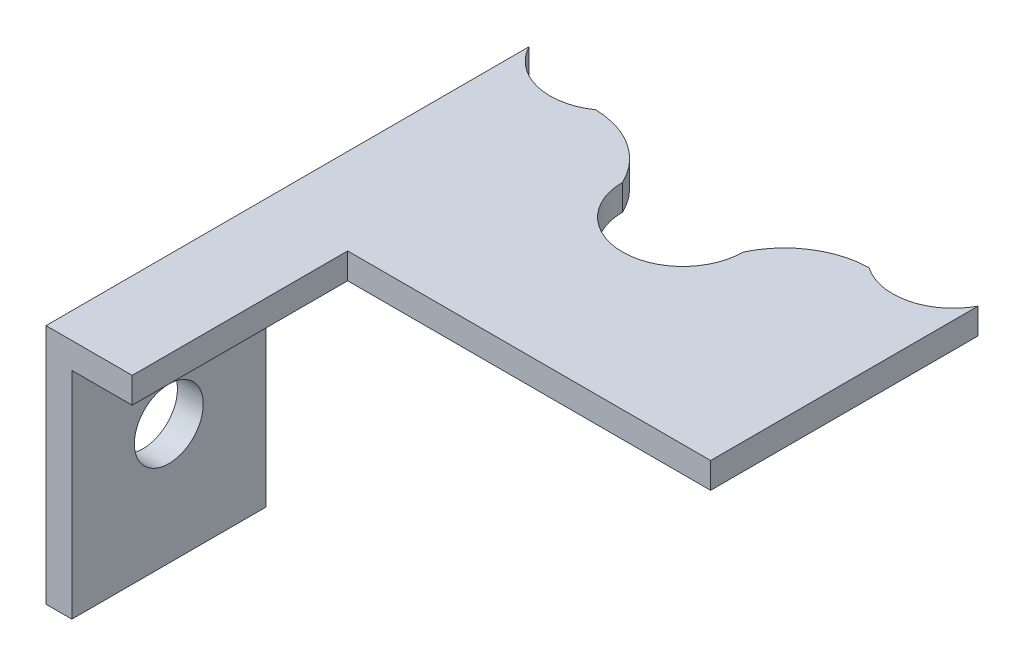
ISO-10303-21;
HEADER;
FILE_DESCRIPTION(('STEP AP214'),'2;1');
FILE_NAME('part.step','',(''),(''),'','','');
FILE_SCHEMA(('AUTOMOTIVE_DESIGN { 1 0 10303 214 1 1 1 1 }'));
ENDSEC;
DATA;
#1=APPLICATION_CONTEXT('core data for automotive mechanical design processes');
#2=APPLICATION_PROTOCOL_DEFINITION('international standard','automotive_design',2000,#1);
#3=PRODUCT_CONTEXT('',#1,'mechanical');
#4=PRODUCT('Part','Part','',(#3));
#5=PRODUCT_RELATED_PRODUCT_CATEGORY('part','',(#4));
#6=PRODUCT_DEFINITION_FORMATION('','',#4);
#7=PRODUCT_DEFINITION_CONTEXT('part definition',#1,'design');
#8=PRODUCT_DEFINITION('design','',#6,#7);
#9=PRODUCT_DEFINITION_SHAPE('','',#8);
#10=(LENGTH_UNIT() NAMED_UNIT(*) SI_UNIT(.MILLI.,.METRE.));
#11=(NAMED_UNIT(*) PLANE_ANGLE_UNIT() SI_UNIT($,.RADIAN.));
#12=(NAMED_UNIT(*) SI_UNIT($,.STERADIAN.) SOLID_ANGLE_UNIT());
#13=UNCERTAINTY_MEASURE_WITH_UNIT(LENGTH_MEASURE(1.E-05),#10,'distance_accuracy_value','');
#14=(GEOMETRIC_REPRESENTATION_CONTEXT(3) GLOBAL_UNCERTAINTY_ASSIGNED_CONTEXT((#13)) GLOBAL_UNIT_ASSIGNED_CONTEXT((#10,
#11,#12)) REPRESENTATION_CONTEXT('',''));
#15=CARTESIAN_POINT('',(0.,0.,0.));
#16=DIRECTION('',(0.,0.,1.));
#17=DIRECTION('',(1.,0.,0.));
#18=AXIS2_PLACEMENT_3D('',#15,#16,#17);
#19=CARTESIAN_POINT('',(16.0451571243017,0.,4.26440295899608));
#20=DIRECTION('',(0.,1.,0.));
#21=DIRECTION('',(0.,0.,1.));
#22=AXIS2_PLACEMENT_3D('',#19,#20,#21);
#23=PLANE('',#22);
#24=DIRECTION('',(0.,0.,1.));
#25=VECTOR('',#24,1.);
#26=CARTESIAN_POINT('',(-23.0555691185354,0.,47.8349535593541));
#27=LINE('',#26,#25);
#28=CARTESIAN_POINT('',(-23.0555691185354,0.,25.3349535593541));
#29=VERTEX_POINT('',#28);
#30=CARTESIAN_POINT('',(-23.0555691185354,0.,47.8349535593541));
#31=VERTEX_POINT('',#30);
#32=EDGE_CURVE('E153',#29,#31,#27,.T.);
#33=ORIENTED_EDGE('',*,*,#32,.F.);
#34=DIRECTION('',(1.,0.,0.));
#35=VECTOR('',#34,1.);
#36=CARTESIAN_POINT('',(-26.0555691185354,0.,25.3349535593541));
#37=LINE('',#36,#35);
#38=CARTESIAN_POINT('',(-26.0555691185354,0.,25.3349535593541));
#39=VERTEX_POINT('',#38);
#40=EDGE_CURVE('E54',#39,#29,#37,.T.);
#41=ORIENTED_EDGE('',*,*,#40,.F.);
#42=DIRECTION('',(0.,0.,1.));
#43=VECTOR('',#42,1.);
#44=CARTESIAN_POINT('',(-26.0555691185354,0.,22.8349535593541));
#45=LINE('',#44,#43);
#46=CARTESIAN_POINT('',(-26.0555691185354,0.,-8.18804644064587));
#47=VERTEX_POINT('',#46);
#48=EDGE_CURVE('E157',#47,#39,#45,.T.);
#49=ORIENTED_EDGE('',*,*,#48,.F.);
#50=CARTESIAN_POINT('',(-19.8752830168529,0.,-11.4749999999999));
#51=DIRECTION('',(0.,-1.,0.));
#52=DIRECTION('',(0.,0.,-1.));
#53=AXIS2_PLACEMENT_3D('',#50,#51,#52);
#54=CIRCLE('',#53,7.);
#55=CARTESIAN_POINT('',(-15.8700792263388,0.,-5.73406431002294));
#56=VERTEX_POINT('',#55);
#57=EDGE_CURVE('E206',#56,#47,#54,.T.);
#58=ORIENTED_EDGE('',*,*,#57,.F.);
#59=CARTESIAN_POINT('',(-16.0451571243017,0.,4.26440295899608));
#60=DIRECTION('',(0.,1.,0.));
#61=DIRECTION('',(0.,0.,1.));
#62=AXIS2_PLACEMENT_3D('',#59,#60,#61);
#63=CIRCLE('',#62,9.99999999999999);
#64=CARTESIAN_POINT('',(-7.,0.,0.));
#65=VERTEX_POINT('',#64);
#66=EDGE_CURVE('E204',#65,#56,#63,.T.);
#67=ORIENTED_EDGE('',*,*,#66,.F.);
#68=CARTESIAN_POINT('',(0.,0.,0.));
#69=DIRECTION('',(0.,-1.,0.));
#70=DIRECTION('',(0.,0.,-1.));
#71=AXIS2_PLACEMENT_3D('',#68,#69,#70);
#72=CIRCLE('',#71,7.);
#73=CARTESIAN_POINT('',(7.,0.,0.));
#74=VERTEX_POINT('',#73);
#75=EDGE_CURVE('E202',#74,#65,#72,.T.);
#76=ORIENTED_EDGE('',*,*,#75,.F.);
#77=CARTESIAN_POINT('',(16.0451571243017,0.,4.26440295899608));
#78=DIRECTION('',(0.,1.,0.));
#79=DIRECTION('',(0.,0.,1.));
#80=AXIS2_PLACEMENT_3D('',#77,#78,#79);
#81=CIRCLE('',#80,10.);
#82=CARTESIAN_POINT('',(15.8700792263388,0.,-5.73406431002295));
#83=VERTEX_POINT('',#82);
#84=EDGE_CURVE('E180',#83,#74,#81,.T.);
#85=ORIENTED_EDGE('',*,*,#84,.F.);
#86=CARTESIAN_POINT('',(19.8752830168529,0.,-11.4749999999999));
#87=DIRECTION('',(0.,-1.,0.));
#88=DIRECTION('',(0.,0.,1.));
#89=AXIS2_PLACEMENT_3D('',#86,#87,#88);
#90=CIRCLE('',#89,7.);
#91=CARTESIAN_POINT('',(26.0555691185354,0.,-8.18804644064582));
#92=VERTEX_POINT('',#91);
#93=EDGE_CURVE('E185',#92,#83,#90,.T.);
#94=ORIENTED_EDGE('',*,*,#93,.F.);
#95=DIRECTION('',(0.,0.,-1.));
#96=VECTOR('',#95,1.);
#97=CARTESIAN_POINT('',(26.0555691185354,0.,-8.18804644064582));
#98=LINE('',#97,#96);
#99=CARTESIAN_POINT('',(26.0555691185354,0.,22.8349535593541));
#100=VERTEX_POINT('',#99);
#101=EDGE_CURVE('E211',#100,#92,#98,.T.);
#102=ORIENTED_EDGE('',*,*,#101,.F.);
#103=DIRECTION('',(1.,0.,0.));
#104=VECTOR('',#103,1.);
#105=CARTESIAN_POINT('',(26.0555691185354,0.,22.8349535593541));
#106=LINE('',#105,#104);
#107=CARTESIAN_POINT('',(-16.0555691185354,0.,22.8349535593541));
#108=VERTEX_POINT('',#107);
#109=EDGE_CURVE('E209',#108,#100,#106,.T.);
#110=ORIENTED_EDGE('',*,*,#109,.F.);
#111=DIRECTION('',(0.,0.,-1.));
#112=VECTOR('',#111,1.);
#113=CARTESIAN_POINT('',(-16.0555691185354,0.,47.8349535593541));
#114=LINE('',#113,#112);
#115=CARTESIAN_POINT('',(-16.0555691185354,0.,47.8349535593541));
#116=VERTEX_POINT('',#115);
#117=EDGE_CURVE('E177',#116,#108,#114,.T.);
#118=ORIENTED_EDGE('',*,*,#117,.F.);
#119=DIRECTION('',(1.,0.,0.));
#120=VECTOR('',#119,1.);
#121=CARTESIAN_POINT('',(-26.0555691185354,0.,47.8349535593541));
#122=LINE('',#121,#120);
#123=EDGE_CURVE('E60',#31,#116,#122,.T.);
#124=ORIENTED_EDGE('',*,*,#123,.F.);
#125=EDGE_LOOP('',(#33,#41,#49,#58,#67,#76,#85,#94,#102,#110,#118,#124));
#126=FACE_BOUND('',#125,.T.);
#127=ADVANCED_FACE('F39',(#126),#23,.F.);
#128=CARTESIAN_POINT('',(26.0555691185354,3.,22.8349535593541));
#129=DIRECTION('',(0.,0.,-1.));
#130=DIRECTION('',(-1.,0.,0.));
#131=AXIS2_PLACEMENT_3D('',#128,#129,#130);
#132=PLANE('',#131);
#133=DIRECTION('',(0.,1.,0.));
#134=VECTOR('',#133,1.);
#135=CARTESIAN_POINT('',(-16.0555691185354,3.,22.8349535593541));
#136=LINE('',#135,#134);
#137=CARTESIAN_POINT('',(-16.0555691185354,3.,22.8349535593541));
#138=VERTEX_POINT('',#137);
#139=EDGE_CURVE('E158',#108,#138,#136,.T.);
#140=ORIENTED_EDGE('',*,*,#139,.F.);
#141=ORIENTED_EDGE('',*,*,#109,.T.);
#142=DIRECTION('',(0.,-1.,0.));
#143=VECTOR('',#142,1.);
#144=CARTESIAN_POINT('',(26.0555691185354,3.,22.8349535593541));
#145=LINE('',#144,#143);
#146=CARTESIAN_POINT('',(26.0555691185354,3.,22.8349535593541));
#147=VERTEX_POINT('',#146);
#148=EDGE_CURVE('E219',#147,#100,#145,.T.);
#149=ORIENTED_EDGE('',*,*,#148,.F.);
#150=DIRECTION('',(1.,0.,0.));
#151=VECTOR('',#150,1.);
#152=CARTESIAN_POINT('',(26.0555691185354,3.,22.8349535593541));
#153=LINE('',#152,#151);
#154=EDGE_CURVE('E193',#138,#147,#153,.T.);
#155=ORIENTED_EDGE('',*,*,#154,.F.);
#156=EDGE_LOOP('',(#140,#141,#149,#155));
#157=FACE_BOUND('',#156,.T.);
#158=ADVANCED_FACE('F261',(#157),#132,.F.);
#159=CARTESIAN_POINT('',(16.0451571243017,3.,4.26440295899608));
#160=DIRECTION('',(0.,-1.,0.));
#161=DIRECTION('',(0.,0.,-1.));
#162=AXIS2_PLACEMENT_3D('',#159,#160,#161);
#163=CYLINDRICAL_SURFACE('',#162,10.);
#164=ORIENTED_EDGE('',*,*,#84,.T.);
#165=DIRECTION('',(0.,-1.,0.));
#166=VECTOR('',#165,1.);
#167=CARTESIAN_POINT('',(7.,3.,0.));
#168=LINE('',#167,#166);
#169=CARTESIAN_POINT('',(7.,3.,0.));
#170=VERTEX_POINT('',#169);
#171=EDGE_CURVE('E11',#170,#74,#168,.T.);
#172=ORIENTED_EDGE('',*,*,#171,.F.);
#173=CARTESIAN_POINT('',(16.0451571243017,3.,4.26440295899608));
#174=DIRECTION('',(0.,1.,0.));
#175=DIRECTION('',(0.,0.,1.));
#176=AXIS2_PLACEMENT_3D('',#173,#174,#175);
#177=CIRCLE('',#176,10.);
#178=CARTESIAN_POINT('',(15.8700792263388,3.,-5.73406431002295));
#179=VERTEX_POINT('',#178);
#180=EDGE_CURVE('E181',#179,#170,#177,.T.);
#181=ORIENTED_EDGE('',*,*,#180,.F.);
#182=DIRECTION('',(0.,-1.,0.));
#183=VECTOR('',#182,1.);
#184=CARTESIAN_POINT('',(15.8700792263388,3.,-5.73406431002295));
#185=LINE('',#184,#183);
#186=EDGE_CURVE('E199',#179,#83,#185,.T.);
#187=ORIENTED_EDGE('',*,*,#186,.T.);
#188=EDGE_LOOP('',(#164,#172,#181,#187));
#189=FACE_BOUND('',#188,.T.);
#190=ADVANCED_FACE('F41',(#189),#163,.T.);
#191=CARTESIAN_POINT('',(0.,3.,0.));
#192=DIRECTION('',(0.,-1.,0.));
#193=DIRECTION('',(0.,0.,-1.));
#194=AXIS2_PLACEMENT_3D('',#191,#192,#193);
#195=CYLINDRICAL_SURFACE('',#194,7.);
#196=ORIENTED_EDGE('',*,*,#75,.T.);
#197=DIRECTION('',(0.,-1.,0.));
#198=VECTOR('',#197,1.);
#199=CARTESIAN_POINT('',(-7.,3.,0.));
#200=LINE('',#199,#198);
#201=CARTESIAN_POINT('',(-7.,3.,0.));
#202=VERTEX_POINT('',#201);
#203=EDGE_CURVE('E47',#202,#65,#200,.T.);
#204=ORIENTED_EDGE('',*,*,#203,.F.);
#205=CARTESIAN_POINT('',(0.,3.,0.));
#206=DIRECTION('',(0.,-1.,0.));
#207=DIRECTION('',(0.,0.,-1.));
#208=AXIS2_PLACEMENT_3D('',#205,#206,#207);
#209=CIRCLE('',#208,7.);
#210=EDGE_CURVE('E184',#170,#202,#209,.T.);
#211=ORIENTED_EDGE('',*,*,#210,.F.);
#212=ORIENTED_EDGE('',*,*,#171,.T.);
#213=EDGE_LOOP('',(#196,#204,#211,#212));
#214=FACE_BOUND('',#213,.T.);
#215=ADVANCED_FACE('F246',(#214),#195,.F.);
#216=CARTESIAN_POINT('',(-16.0451571243017,3.,4.26440295899608));
#217=DIRECTION('',(0.,-1.,0.));
#218=DIRECTION('',(0.,0.,-1.));
#219=AXIS2_PLACEMENT_3D('',#216,#217,#218);
#220=CYLINDRICAL_SURFACE('',#219,9.99999999999999);
#221=ORIENTED_EDGE('',*,*,#66,.T.);
#222=DIRECTION('',(0.,-1.,0.));
#223=VECTOR('',#222,1.);
#224=CARTESIAN_POINT('',(-15.8700792263388,3.,-5.73406431002294));
#225=LINE('',#224,#223);
#226=CARTESIAN_POINT('',(-15.8700792263388,3.,-5.73406431002294));
#227=VERTEX_POINT('',#226);
#228=EDGE_CURVE('E224',#227,#56,#225,.T.);
#229=ORIENTED_EDGE('',*,*,#228,.F.);
#230=CARTESIAN_POINT('',(-16.0451571243017,3.,4.26440295899608));
#231=DIRECTION('',(0.,1.,0.));
#232=DIRECTION('',(0.,0.,1.));
#233=AXIS2_PLACEMENT_3D('',#230,#231,#232);
#234=CIRCLE('',#233,9.99999999999999);
#235=EDGE_CURVE('E187',#202,#227,#234,.T.);
#236=ORIENTED_EDGE('',*,*,#235,.F.);
#237=ORIENTED_EDGE('',*,*,#203,.T.);
#238=EDGE_LOOP('',(#221,#229,#236,#237));
#239=FACE_BOUND('',#238,.T.);
#240=ADVANCED_FACE('F231',(#239),#220,.T.);
#241=CARTESIAN_POINT('',(-19.8752830168529,3.,-11.4749999999999));
#242=DIRECTION('',(0.,-1.,0.));
#243=DIRECTION('',(0.,0.,-1.));
#244=AXIS2_PLACEMENT_3D('',#241,#242,#243);
#245=CYLINDRICAL_SURFACE('',#244,7.);
#246=ORIENTED_EDGE('',*,*,#57,.T.);
#247=DIRECTION('',(0.,-1.,0.));
#248=VECTOR('',#247,1.);
#249=CARTESIAN_POINT('',(-26.0555691185354,3.,-8.18804644064587));
#250=LINE('',#249,#248);
#251=CARTESIAN_POINT('',(-26.0555691185354,3.,-8.18804644064587));
#252=VERTEX_POINT('',#251);
#253=EDGE_CURVE('E222',#252,#47,#250,.T.);
#254=ORIENTED_EDGE('',*,*,#253,.F.);
#255=CARTESIAN_POINT('',(-19.8752830168529,3.,-11.4749999999999));
#256=DIRECTION('',(0.,-1.,0.));
#257=DIRECTION('',(0.,0.,-1.));
#258=AXIS2_PLACEMENT_3D('',#255,#256,#257);
#259=CIRCLE('',#258,7.);
#260=EDGE_CURVE('E189',#227,#252,#259,.T.);
#261=ORIENTED_EDGE('',*,*,#260,.F.);
#262=ORIENTED_EDGE('',*,*,#228,.T.);
#263=EDGE_LOOP('',(#246,#254,#261,#262));
#264=FACE_BOUND('',#263,.T.);
#265=ADVANCED_FACE('F238',(#264),#245,.F.);
#266=CARTESIAN_POINT('',(-26.0555691185354,3.,22.8349535593541));
#267=DIRECTION('',(1.,0.,0.));
#268=DIRECTION('',(0.,0.,-1.));
#269=AXIS2_PLACEMENT_3D('',#266,#267,#268);
#270=PLANE('',#269);
#271=CARTESIAN_POINT('',(-26.0555691185354,-11.,36.5849535593541));
#272=DIRECTION('',(-1.,0.,0.));
#273=DIRECTION('',(0.,0.,1.));
#274=AXIS2_PLACEMENT_3D('',#271,#272,#273);
#275=CIRCLE('',#274,4.);
#276=CARTESIAN_POINT('',(-26.0555691185354,-11.,40.5849535593541));
#277=VERTEX_POINT('',#276);
#278=EDGE_CURVE('E279',#277,#277,#275,.T.);
#279=ORIENTED_EDGE('',*,*,#278,.F.);
#280=EDGE_LOOP('',(#279));
#281=FACE_BOUND('',#280,.T.);
#282=ORIENTED_EDGE('',*,*,#48,.T.);
#283=DIRECTION('',(0.,1.,0.));
#284=VECTOR('',#283,1.);
#285=CARTESIAN_POINT('',(-26.0555691185354,-25.,25.3349535593541));
#286=LINE('',#285,#284);
#287=CARTESIAN_POINT('',(-26.0555691185354,-25.,25.3349535593541));
#288=VERTEX_POINT('',#287);
#289=EDGE_CURVE('E138',#288,#39,#286,.T.);
#290=ORIENTED_EDGE('',*,*,#289,.F.);
#291=DIRECTION('',(0.,0.,-1.));
#292=VECTOR('',#291,1.);
#293=CARTESIAN_POINT('',(-26.0555691185354,-25.,47.8349535593541));
#294=LINE('',#293,#292);
#295=CARTESIAN_POINT('',(-26.0555691185354,-25.,47.8349535593541));
#296=VERTEX_POINT('',#295);
#297=EDGE_CURVE('E144',#296,#288,#294,.T.);
#298=ORIENTED_EDGE('',*,*,#297,.F.);
#299=DIRECTION('',(0.,-1.,0.));
#300=VECTOR('',#299,1.);
#301=CARTESIAN_POINT('',(-26.0555691185354,3.,47.8349535593541));
#302=LINE('',#301,#300);
#303=CARTESIAN_POINT('',(-26.0555691185354,3.,47.8349535593541));
#304=VERTEX_POINT('',#303);
#305=EDGE_CURVE('E169',#304,#296,#302,.T.);
#306=ORIENTED_EDGE('',*,*,#305,.F.);
#307=DIRECTION('',(0.,0.,1.));
#308=VECTOR('',#307,1.);
#309=CARTESIAN_POINT('',(-26.0555691185354,3.,22.8349535593541));
#310=LINE('',#309,#308);
#311=EDGE_CURVE('E191',#252,#304,#310,.T.);
#312=ORIENTED_EDGE('',*,*,#311,.F.);
#313=ORIENTED_EDGE('',*,*,#253,.T.);
#314=EDGE_LOOP('',(#282,#290,#298,#306,#312,#313));
#315=FACE_BOUND('',#314,.T.);
#316=ADVANCED_FACE('F155',(#281,#315),#270,.F.);
#317=CARTESIAN_POINT('',(26.0555691185354,3.,-8.18804644064582));
#318=DIRECTION('',(-1.,0.,0.));
#319=DIRECTION('',(0.,0.,1.));
#320=AXIS2_PLACEMENT_3D('',#317,#318,#319);
#321=PLANE('',#320);
#322=ORIENTED_EDGE('',*,*,#101,.T.);
#323=DIRECTION('',(0.,-1.,0.));
#324=VECTOR('',#323,1.);
#325=CARTESIAN_POINT('',(26.0555691185354,3.,-8.18804644064582));
#326=LINE('',#325,#324);
#327=CARTESIAN_POINT('',(26.0555691185354,3.,-8.18804644064582));
#328=VERTEX_POINT('',#327);
#329=EDGE_CURVE('E216',#328,#92,#326,.T.);
#330=ORIENTED_EDGE('',*,*,#329,.F.);
#331=DIRECTION('',(0.,0.,-1.));
#332=VECTOR('',#331,1.);
#333=CARTESIAN_POINT('',(26.0555691185354,3.,-8.18804644064582));
#334=LINE('',#333,#332);
#335=EDGE_CURVE('E195',#147,#328,#334,.T.);
#336=ORIENTED_EDGE('',*,*,#335,.F.);
#337=ORIENTED_EDGE('',*,*,#148,.T.);
#338=EDGE_LOOP('',(#322,#330,#336,#337));
#339=FACE_BOUND('',#338,.T.);
#340=ADVANCED_FACE('F258',(#339),#321,.F.);
#341=CARTESIAN_POINT('',(19.8752830168529,3.,-11.4749999999999));
#342=DIRECTION('',(0.,-1.,0.));
#343=DIRECTION('',(0.,0.,-1.));
#344=AXIS2_PLACEMENT_3D('',#341,#342,#343);
#345=CYLINDRICAL_SURFACE('',#344,7.);
#346=ORIENTED_EDGE('',*,*,#93,.T.);
#347=ORIENTED_EDGE('',*,*,#186,.F.);
#348=CARTESIAN_POINT('',(19.8752830168529,3.,-11.4749999999999));
#349=DIRECTION('',(0.,-1.,0.));
#350=DIRECTION('',(0.,0.,1.));
#351=AXIS2_PLACEMENT_3D('',#348,#349,#350);
#352=CIRCLE('',#351,7.);
#353=EDGE_CURVE('E197',#328,#179,#352,.T.);
#354=ORIENTED_EDGE('',*,*,#353,.F.);
#355=ORIENTED_EDGE('',*,*,#329,.T.);
#356=EDGE_LOOP('',(#346,#347,#354,#355));
#357=FACE_BOUND('',#356,.T.);
#358=ADVANCED_FACE('F253',(#357),#345,.F.);
#359=CARTESIAN_POINT('',(16.0451571243017,3.,4.26440295899608));
#360=DIRECTION('',(0.,1.,0.));
#361=DIRECTION('',(0.,0.,1.));
#362=AXIS2_PLACEMENT_3D('',#359,#360,#361);
#363=PLANE('',#362);
#364=ORIENTED_EDGE('',*,*,#180,.T.);
#365=ORIENTED_EDGE('',*,*,#210,.T.);
#366=ORIENTED_EDGE('',*,*,#235,.T.);
#367=ORIENTED_EDGE('',*,*,#260,.T.);
#368=ORIENTED_EDGE('',*,*,#311,.T.);
#369=DIRECTION('',(-1.,0.,0.));
#370=VECTOR('',#369,1.);
#371=CARTESIAN_POINT('',(-26.0555691185354,3.,47.8349535593541));
#372=LINE('',#371,#370);
#373=CARTESIAN_POINT('',(-16.0555691185354,3.,47.8349535593541));
#374=VERTEX_POINT('',#373);
#375=EDGE_CURVE('E161',#374,#304,#372,.T.);
#376=ORIENTED_EDGE('',*,*,#375,.F.);
#377=DIRECTION('',(0.,0.,-1.));
#378=VECTOR('',#377,1.);
#379=CARTESIAN_POINT('',(-16.0555691185354,3.,47.8349535593541));
#380=LINE('',#379,#378);
#381=EDGE_CURVE('E173',#374,#138,#380,.T.);
#382=ORIENTED_EDGE('',*,*,#381,.T.);
#383=ORIENTED_EDGE('',*,*,#154,.T.);
#384=ORIENTED_EDGE('',*,*,#335,.T.);
#385=ORIENTED_EDGE('',*,*,#353,.T.);
#386=EDGE_LOOP('',(#364,#365,#366,#367,#368,#376,#382,#383,#384,#385));
#387=FACE_BOUND('',#386,.T.);
#388=ADVANCED_FACE('F243',(#387),#363,.T.);
#389=CARTESIAN_POINT('',(-16.0555691185354,3.,47.8349535593541));
#390=DIRECTION('',(-1.,0.,0.));
#391=DIRECTION('',(0.,0.,1.));
#392=AXIS2_PLACEMENT_3D('',#389,#390,#391);
#393=PLANE('',#392);
#394=ORIENTED_EDGE('',*,*,#139,.T.);
#395=ORIENTED_EDGE('',*,*,#381,.F.);
#396=DIRECTION('',(0.,1.,0.));
#397=VECTOR('',#396,1.);
#398=CARTESIAN_POINT('',(-16.0555691185354,3.,47.8349535593541));
#399=LINE('',#398,#397);
#400=EDGE_CURVE('E172',#116,#374,#399,.T.);
#401=ORIENTED_EDGE('',*,*,#400,.F.);
#402=ORIENTED_EDGE('',*,*,#117,.T.);
#403=EDGE_LOOP('',(#394,#395,#401,#402));
#404=FACE_BOUND('',#403,.T.);
#405=ADVANCED_FACE('F264',(#404),#393,.F.);
#406=CARTESIAN_POINT('',(0.,0.,47.8349535593541));
#407=DIRECTION('',(0.,0.,-1.));
#408=DIRECTION('',(-1.,0.,0.));
#409=AXIS2_PLACEMENT_3D('',#406,#407,#408);
#410=PLANE('',#409);
#411=ORIENTED_EDGE('',*,*,#375,.T.);
#412=ORIENTED_EDGE('',*,*,#305,.T.);
#413=DIRECTION('',(-1.,0.,0.));
#414=VECTOR('',#413,1.);
#415=CARTESIAN_POINT('',(-26.0555691185354,-25.,47.8349535593541));
#416=LINE('',#415,#414);
#417=CARTESIAN_POINT('',(-23.0555691185354,-25.,47.8349535593541));
#418=VERTEX_POINT('',#417);
#419=EDGE_CURVE('E150',#418,#296,#416,.T.);
#420=ORIENTED_EDGE('',*,*,#419,.F.);
#421=DIRECTION('',(0.,1.,0.));
#422=VECTOR('',#421,1.);
#423=CARTESIAN_POINT('',(-23.0555691185354,-25.,47.8349535593541));
#424=LINE('',#423,#422);
#425=EDGE_CURVE('E163',#418,#31,#424,.T.);
#426=ORIENTED_EDGE('',*,*,#425,.T.);
#427=ORIENTED_EDGE('',*,*,#123,.T.);
#428=ORIENTED_EDGE('',*,*,#400,.T.);
#429=EDGE_LOOP('',(#411,#412,#420,#426,#427,#428));
#430=FACE_BOUND('',#429,.T.);
#431=ADVANCED_FACE('F267',(#430),#410,.F.);
#432=CARTESIAN_POINT('',(-26.0555691185354,-25.,25.3349535593541));
#433=DIRECTION('',(0.,0.,1.));
#434=DIRECTION('',(1.,0.,0.));
#435=AXIS2_PLACEMENT_3D('',#432,#433,#434);
#436=PLANE('',#435);
#437=ORIENTED_EDGE('',*,*,#40,.T.);
#438=DIRECTION('',(0.,1.,0.));
#439=VECTOR('',#438,1.);
#440=CARTESIAN_POINT('',(-23.0555691185354,-25.,25.3349535593541));
#441=LINE('',#440,#439);
#442=CARTESIAN_POINT('',(-23.0555691185354,-25.,25.3349535593541));
#443=VERTEX_POINT('',#442);
#444=EDGE_CURVE('E140',#443,#29,#441,.T.);
#445=ORIENTED_EDGE('',*,*,#444,.F.);
#446=DIRECTION('',(1.,0.,0.));
#447=VECTOR('',#446,1.);
#448=CARTESIAN_POINT('',(-26.0555691185354,-25.,25.3349535593541));
#449=LINE('',#448,#447);
#450=EDGE_CURVE('E134',#288,#443,#449,.T.);
#451=ORIENTED_EDGE('',*,*,#450,.F.);
#452=ORIENTED_EDGE('',*,*,#289,.T.);
#453=EDGE_LOOP('',(#437,#445,#451,#452));
#454=FACE_BOUND('',#453,.T.);
#455=ADVANCED_FACE('F136',(#454),#436,.F.);
#456=CARTESIAN_POINT('',(-23.0555691185354,-25.,47.8349535593541));
#457=DIRECTION('',(-1.,0.,0.));
#458=DIRECTION('',(0.,0.,1.));
#459=AXIS2_PLACEMENT_3D('',#456,#457,#458);
#460=PLANE('',#459);
#461=CARTESIAN_POINT('',(-23.0555691185354,-11.,36.5849535593541));
#462=DIRECTION('',(-1.,0.,0.));
#463=DIRECTION('',(0.,0.,1.));
#464=AXIS2_PLACEMENT_3D('',#461,#462,#463);
#465=CIRCLE('',#464,4.);
#466=CARTESIAN_POINT('',(-23.0555691185354,-11.,40.5849535593541));
#467=VERTEX_POINT('',#466);
#468=EDGE_CURVE('E274',#467,#467,#465,.F.);
#469=ORIENTED_EDGE('',*,*,#468,.F.);
#470=EDGE_LOOP('',(#469));
#471=FACE_BOUND('',#470,.T.);
#472=ORIENTED_EDGE('',*,*,#32,.T.);
#473=ORIENTED_EDGE('',*,*,#425,.F.);
#474=DIRECTION('',(0.,0.,1.));
#475=VECTOR('',#474,1.);
#476=CARTESIAN_POINT('',(-23.0555691185354,-25.,47.8349535593541));
#477=LINE('',#476,#475);
#478=EDGE_CURVE('E143',#443,#418,#477,.T.);
#479=ORIENTED_EDGE('',*,*,#478,.F.);
#480=ORIENTED_EDGE('',*,*,#444,.T.);
#481=EDGE_LOOP('',(#472,#473,#479,#480));
#482=FACE_BOUND('',#481,.T.);
#483=ADVANCED_FACE('F318',(#471,#482),#460,.F.);
#484=CARTESIAN_POINT('',(0.,-25.,0.));
#485=DIRECTION('',(0.,-1.,0.));
#486=DIRECTION('',(0.,0.,-1.));
#487=AXIS2_PLACEMENT_3D('',#484,#485,#486);
#488=PLANE('',#487);
#489=ORIENTED_EDGE('',*,*,#297,.T.);
#490=ORIENTED_EDGE('',*,*,#450,.T.);
#491=ORIENTED_EDGE('',*,*,#478,.T.);
#492=ORIENTED_EDGE('',*,*,#419,.T.);
#493=EDGE_LOOP('',(#489,#490,#491,#492));
#494=FACE_BOUND('',#493,.T.);
#495=ADVANCED_FACE('F148',(#494),#488,.T.);
#496=CARTESIAN_POINT('',(-11.7418606195507,-11.,36.5849535593541));
#497=DIRECTION('',(-1.,0.,0.));
#498=DIRECTION('',(0.,0.,1.));
#499=AXIS2_PLACEMENT_3D('',#496,#497,#498);
#500=CYLINDRICAL_SURFACE('',#499,4.);
#501=CARTESIAN_POINT('',(-23.0555691185354,-11.,40.5849535593541));
#502=CARTESIAN_POINT('',(-23.0868191185354,-11.,40.5849535593541));
#503=CARTESIAN_POINT('',(-23.1180691185354,-11.,40.5849535593541));
#504=CARTESIAN_POINT('',(-23.1805691185354,-11.,40.5849535593541));
#505=CARTESIAN_POINT('',(-23.2118191185354,-11.,40.5849535593541));
#506=CARTESIAN_POINT('',(-23.2743191185354,-11.,40.5849535593541));
#507=CARTESIAN_POINT('',(-23.3055691185354,-11.,40.5849535593541));
#508=CARTESIAN_POINT('',(-23.3680691185354,-11.,40.5849535593541));
#509=CARTESIAN_POINT('',(-23.3993191185354,-11.,40.5849535593541));
#510=CARTESIAN_POINT('',(-23.4618191185354,-11.,40.5849535593541));
#511=CARTESIAN_POINT('',(-23.4930691185354,-11.,40.5849535593541));
#512=CARTESIAN_POINT('',(-23.5555691185354,-11.,40.5849535593541));
#513=CARTESIAN_POINT('',(-23.5868191185354,-11.,40.5849535593541));
#514=CARTESIAN_POINT('',(-23.6493191185354,-11.,40.5849535593541));
#515=CARTESIAN_POINT('',(-23.6805691185354,-11.,40.5849535593541));
#516=CARTESIAN_POINT('',(-23.7430691185354,-11.,40.5849535593541));
#517=CARTESIAN_POINT('',(-23.7743191185354,-11.,40.5849535593541));
#518=CARTESIAN_POINT('',(-23.8368191185354,-11.,40.5849535593541));
#519=CARTESIAN_POINT('',(-23.8680691185354,-11.,40.5849535593541));
#520=CARTESIAN_POINT('',(-23.9305691185354,-11.,40.5849535593541));
#521=CARTESIAN_POINT('',(-23.9618191185354,-11.,40.5849535593541));
#522=CARTESIAN_POINT('',(-24.0243191185354,-11.,40.5849535593541));
#523=CARTESIAN_POINT('',(-24.0555691185354,-11.,40.5849535593541));
#524=CARTESIAN_POINT('',(-24.1180691185354,-11.,40.5849535593541));
#525=CARTESIAN_POINT('',(-24.1493191185354,-11.,40.5849535593541));
#526=CARTESIAN_POINT('',(-24.2118191185354,-11.,40.5849535593541));
#527=CARTESIAN_POINT('',(-24.2430691185354,-11.,40.5849535593541));
#528=CARTESIAN_POINT('',(-24.3055691185354,-11.,40.5849535593541));
#529=CARTESIAN_POINT('',(-24.3368191185354,-11.,40.5849535593541));
#530=CARTESIAN_POINT('',(-24.3993191185354,-11.,40.5849535593541));
#531=CARTESIAN_POINT('',(-24.4305691185354,-11.,40.5849535593541));
#532=CARTESIAN_POINT('',(-24.4930691185354,-11.,40.5849535593541));
#533=CARTESIAN_POINT('',(-24.5243191185354,-11.,40.5849535593541));
#534=CARTESIAN_POINT('',(-24.5868191185354,-11.,40.5849535593541));
#535=CARTESIAN_POINT('',(-24.6180691185354,-11.,40.5849535593541));
#536=CARTESIAN_POINT('',(-24.6805691185354,-11.,40.5849535593541));
#537=CARTESIAN_POINT('',(-24.7118191185354,-11.,40.5849535593541));
#538=CARTESIAN_POINT('',(-24.7743191185354,-11.,40.5849535593541));
#539=CARTESIAN_POINT('',(-24.8055691185354,-11.,40.5849535593541));
#540=CARTESIAN_POINT('',(-24.8680691185354,-11.,40.5849535593541));
#541=CARTESIAN_POINT('',(-24.8993191185354,-11.,40.5849535593541));
#542=CARTESIAN_POINT('',(-24.9618191185354,-11.,40.5849535593541));
#543=CARTESIAN_POINT('',(-24.9930691185354,-11.,40.5849535593541));
#544=CARTESIAN_POINT('',(-25.0555691185354,-11.,40.5849535593541));
#545=CARTESIAN_POINT('',(-25.0868191185354,-11.,40.5849535593541));
#546=CARTESIAN_POINT('',(-25.1493191185354,-11.,40.5849535593541));
#547=CARTESIAN_POINT('',(-25.1805691185354,-11.,40.5849535593541));
#548=CARTESIAN_POINT('',(-25.2430691185354,-11.,40.5849535593541));
#549=CARTESIAN_POINT('',(-25.2743191185354,-11.,40.5849535593541));
#550=CARTESIAN_POINT('',(-25.3368191185354,-11.,40.5849535593541));
#551=CARTESIAN_POINT('',(-25.3680691185354,-11.,40.5849535593541));
#552=CARTESIAN_POINT('',(-25.4305691185354,-11.,40.5849535593541));
#553=CARTESIAN_POINT('',(-25.4618191185354,-11.,40.5849535593541));
#554=CARTESIAN_POINT('',(-25.5243191185354,-11.,40.5849535593541));
#555=CARTESIAN_POINT('',(-25.5555691185354,-11.,40.5849535593541));
#556=CARTESIAN_POINT('',(-25.6180691185354,-11.,40.5849535593541));
#557=CARTESIAN_POINT('',(-25.6493191185354,-11.,40.5849535593541));
#558=CARTESIAN_POINT('',(-25.7118191185354,-11.,40.5849535593541));
#559=CARTESIAN_POINT('',(-25.7430691185354,-11.,40.5849535593541));
#560=CARTESIAN_POINT('',(-25.8055691185354,-11.,40.5849535593541));
#561=CARTESIAN_POINT('',(-25.8368191185354,-11.,40.5849535593541));
#562=CARTESIAN_POINT('',(-25.8993191185354,-11.,40.5849535593541));
#563=CARTESIAN_POINT('',(-25.9305691185354,-11.,40.5849535593541));
#564=CARTESIAN_POINT('',(-25.9930691185354,-11.,40.5849535593541));
#565=CARTESIAN_POINT('',(-26.0243191185354,-11.,40.5849535593541));
#566=CARTESIAN_POINT('',(-26.0555691185354,-11.,40.5849535593541));
#567=B_SPLINE_CURVE_WITH_KNOTS('',3,(#501,#502,#503,#504,#505,#506,#507,#508,#509,#510,#511,
#512,#513,#514,#515,#516,#517,#518,#519,#520,#521,#522,#523,#524,#525,#526,#527,#528,#529,#530,
#531,#532,#533,#534,#535,#536,#537,#538,#539,#540,#541,#542,#543,#544,#545,#546,#547,#548,#549,
#550,#551,#552,#553,#554,#555,#556,#557,#558,#559,#560,#561,#562,#563,#564,#565,#566),
.UNSPECIFIED.,.F.,.F.,(4,2,2,2,2,2,2,2,2,2,2,2,2,2,2,2,2,2,2,2,2,2,2,2,2,2,2,2,2,2,2,2,4),(0.,
0.0937499999999966,0.1875,0.281249999999997,0.375,0.468749999999997,0.5625,0.656249999999997,
0.750000000000001,0.843749999999997,0.937500000000001,1.03125,1.125,1.21875,1.3125,1.40625,1.5,
1.59375,1.6875,1.78125,1.875,1.96875,2.0625,2.15625,2.25,2.34375,2.4375,2.53125,2.625,2.71875,
2.8125,2.90625,3.),.UNSPECIFIED.);
#568=EDGE_CURVE('BSEAM283',#467,#277,#567,.T.);
#569=ORIENTED_EDGE('',*,*,#468,.T.);
#570=ORIENTED_EDGE('',*,*,#278,.T.);
#571=ORIENTED_EDGE('',*,*,#568,.T.);
#572=ORIENTED_EDGE('',*,*,#568,.F.);
#573=EDGE_LOOP('',(#569,#571,#570,#572));
#574=FACE_BOUND('',#573,.T.);
#575=ADVANCED_FACE('F283',(#574),#500,.F.);
#576=CLOSED_SHELL('',(#127,#158,#190,#215,#240,#265,#316,#340,#358,#388,#405,#431,#455,#483,
#495,#575));
#577=MANIFOLD_SOLID_BREP('B2',#576);
#578=ADVANCED_BREP_SHAPE_REPRESENTATION('',(#18,#577),#14);
#579=SHAPE_DEFINITION_REPRESENTATION(#9,#578);
ENDSEC;
END-ISO-10303-21;
